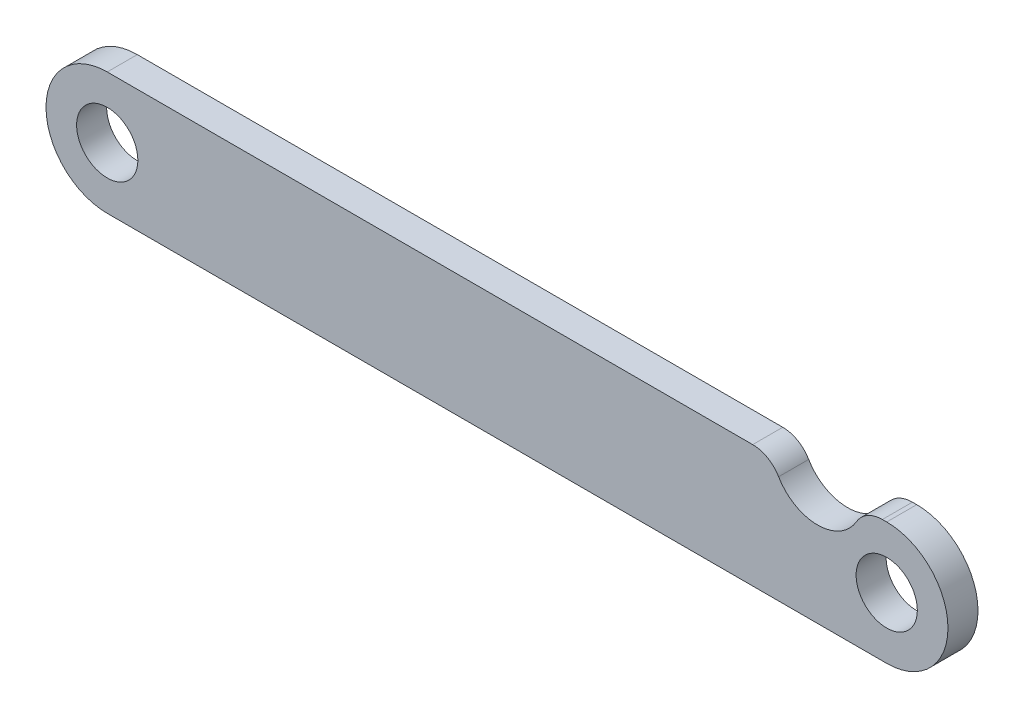
ISO-10303-21;
HEADER;
FILE_DESCRIPTION(('STEP AP214'),'2;1');
FILE_NAME('part.step','',(''),(''),'','','');
FILE_SCHEMA(('AUTOMOTIVE_DESIGN { 1 0 10303 214 1 1 1 1 }'));
ENDSEC;
DATA;
#1=APPLICATION_CONTEXT('core data for automotive mechanical design processes');
#2=APPLICATION_PROTOCOL_DEFINITION('international standard','automotive_design',2000,#1);
#3=PRODUCT_CONTEXT('',#1,'mechanical');
#4=PRODUCT('Part','Part','',(#3));
#5=PRODUCT_RELATED_PRODUCT_CATEGORY('part','',(#4));
#6=PRODUCT_DEFINITION_FORMATION('','',#4);
#7=PRODUCT_DEFINITION_CONTEXT('part definition',#1,'design');
#8=PRODUCT_DEFINITION('design','',#6,#7);
#9=PRODUCT_DEFINITION_SHAPE('','',#8);
#10=(LENGTH_UNIT() NAMED_UNIT(*) SI_UNIT(.MILLI.,.METRE.));
#11=(NAMED_UNIT(*) PLANE_ANGLE_UNIT() SI_UNIT($,.RADIAN.));
#12=(NAMED_UNIT(*) SI_UNIT($,.STERADIAN.) SOLID_ANGLE_UNIT());
#13=UNCERTAINTY_MEASURE_WITH_UNIT(LENGTH_MEASURE(1.E-05),#10,'distance_accuracy_value','');
#14=(GEOMETRIC_REPRESENTATION_CONTEXT(3) GLOBAL_UNCERTAINTY_ASSIGNED_CONTEXT((#13)) GLOBAL_UNIT_ASSIGNED_CONTEXT((#10,
#11,#12)) REPRESENTATION_CONTEXT('',''));
#15=CARTESIAN_POINT('',(0.,0.,0.));
#16=DIRECTION('',(0.,0.,1.));
#17=DIRECTION('',(1.,0.,0.));
#18=AXIS2_PLACEMENT_3D('',#15,#16,#17);
#19=CARTESIAN_POINT('',(0.,2.03803107941855,1.));
#20=DIRECTION('',(0.,1.,0.));
#21=DIRECTION('',(-1.,0.,0.));
#22=AXIS2_PLACEMENT_3D('',#19,#20,#21);
#23=PLANE('',#22);
#24=DIRECTION('',(1.,0.,0.));
#25=VECTOR('',#24,1.);
#26=CARTESIAN_POINT('',(0.,2.03803107941855,0.));
#27=LINE('',#26,#25);
#28=CARTESIAN_POINT('',(-0.144053808082927,2.03803107941855,0.));
#29=VERTEX_POINT('',#28);
#30=CARTESIAN_POINT('',(0.,2.03803107941855,0.));
#31=VERTEX_POINT('',#30);
#32=EDGE_CURVE('E147',#29,#31,#27,.T.);
#33=ORIENTED_EDGE('',*,*,#32,.F.);
#34=DIRECTION('',(0.,0.,-1.));
#35=VECTOR('',#34,1.);
#36=CARTESIAN_POINT('',(-0.144053808082927,2.03803107941855,1.));
#37=LINE('',#36,#35);
#38=CARTESIAN_POINT('',(-0.144053808082927,2.03803107941855,1.));
#39=VERTEX_POINT('',#38);
#40=EDGE_CURVE('E11',#29,#39,#37,.F.);
#41=ORIENTED_EDGE('',*,*,#40,.T.);
#42=DIRECTION('',(1.,0.,0.));
#43=VECTOR('',#42,1.);
#44=CARTESIAN_POINT('',(0.,2.03803107941855,1.));
#45=LINE('',#44,#43);
#46=CARTESIAN_POINT('',(0.,2.03803107941855,1.));
#47=VERTEX_POINT('',#46);
#48=EDGE_CURVE('E127',#39,#47,#45,.T.);
#49=ORIENTED_EDGE('',*,*,#48,.T.);
#50=DIRECTION('',(0.,0.,-1.));
#51=VECTOR('',#50,1.);
#52=CARTESIAN_POINT('',(0.,2.03803107941855,1.));
#53=LINE('',#52,#51);
#54=EDGE_CURVE('E144',#47,#31,#53,.T.);
#55=ORIENTED_EDGE('',*,*,#54,.T.);
#56=EDGE_LOOP('',(#33,#41,#49,#55));
#57=FACE_BOUND('',#56,.T.);
#58=ADVANCED_FACE('F38',(#57),#23,.T.);
#59=CARTESIAN_POINT('',(-25.941113,2.03803107941855,1.));
#60=VERTEX_POINT('',#59);
#61=CARTESIAN_POINT('',(-4.46027180233969,2.03803107941855,1.));
#62=VERTEX_POINT('',#61);
#63=EDGE_CURVE('E108',#60,#62,#45,.T.);
#64=ORIENTED_EDGE('',*,*,#63,.T.);
#65=DIRECTION('',(0.,0.,-1.));
#66=VECTOR('',#65,1.);
#67=CARTESIAN_POINT('',(-4.46027180233969,2.03803107941855,1.));
#68=LINE('',#67,#66);
#69=CARTESIAN_POINT('',(-4.46027180233969,2.03803107941855,0.));
#70=VERTEX_POINT('',#69);
#71=EDGE_CURVE('E114',#62,#70,#68,.T.);
#72=ORIENTED_EDGE('',*,*,#71,.T.);
#73=CARTESIAN_POINT('',(-25.941113,2.03803107941855,0.));
#74=VERTEX_POINT('',#73);
#75=EDGE_CURVE('E111',#74,#70,#27,.T.);
#76=ORIENTED_EDGE('',*,*,#75,.F.);
#77=DIRECTION('',(0.,0.,-1.));
#78=VECTOR('',#77,1.);
#79=CARTESIAN_POINT('',(-25.941113,2.03803107941855,1.));
#80=LINE('',#79,#78);
#81=EDGE_CURVE('E103',#60,#74,#80,.T.);
#82=ORIENTED_EDGE('',*,*,#81,.F.);
#83=EDGE_LOOP('',(#64,#72,#76,#82));
#84=FACE_BOUND('',#83,.T.);
#85=ADVANCED_FACE('F105',(#84),#23,.T.);
#86=CARTESIAN_POINT('',(-25.941113,0.,1.));
#87=DIRECTION('',(0.,0.,-1.));
#88=DIRECTION('',(-1.,0.,0.));
#89=AXIS2_PLACEMENT_3D('',#86,#87,#88);
#90=CYLINDRICAL_SURFACE('',#89,2.03803107941855);
#91=CARTESIAN_POINT('',(-25.941113,0.,0.));
#92=DIRECTION('',(0.,0.,1.));
#93=DIRECTION('',(1.,0.,0.));
#94=AXIS2_PLACEMENT_3D('',#91,#92,#93);
#95=CIRCLE('',#94,2.03803107941855);
#96=CARTESIAN_POINT('',(-25.941113,-2.03803107941855,0.));
#97=VERTEX_POINT('',#96);
#98=EDGE_CURVE('E146',#74,#97,#95,.T.);
#99=ORIENTED_EDGE('',*,*,#98,.T.);
#100=DIRECTION('',(0.,0.,-1.));
#101=VECTOR('',#100,1.);
#102=CARTESIAN_POINT('',(-25.941113,-2.03803107941855,1.));
#103=LINE('',#102,#101);
#104=CARTESIAN_POINT('',(-25.941113,-2.03803107941855,1.));
#105=VERTEX_POINT('',#104);
#106=EDGE_CURVE('E115',#105,#97,#103,.T.);
#107=ORIENTED_EDGE('',*,*,#106,.F.);
#108=CARTESIAN_POINT('',(-25.941113,0.,1.));
#109=DIRECTION('',(0.,0.,1.));
#110=DIRECTION('',(1.,0.,0.));
#111=AXIS2_PLACEMENT_3D('',#108,#109,#110);
#112=CIRCLE('',#111,2.03803107941855);
#113=EDGE_CURVE('E118',#60,#105,#112,.T.);
#114=ORIENTED_EDGE('',*,*,#113,.F.);
#115=ORIENTED_EDGE('',*,*,#81,.T.);
#116=EDGE_LOOP('',(#99,#107,#114,#115));
#117=FACE_BOUND('',#116,.T.);
#118=ADVANCED_FACE('F119',(#117),#90,.T.);
#119=CARTESIAN_POINT('',(0.,-2.03803107941855,1.));
#120=DIRECTION('',(0.,1.,0.));
#121=DIRECTION('',(-1.,0.,0.));
#122=AXIS2_PLACEMENT_3D('',#119,#120,#121);
#123=PLANE('',#122);
#124=DIRECTION('',(1.,0.,0.));
#125=VECTOR('',#124,1.);
#126=CARTESIAN_POINT('',(0.,-2.03803107941855,0.));
#127=LINE('',#126,#125);
#128=CARTESIAN_POINT('',(0.,-2.03803107941855,0.));
#129=VERTEX_POINT('',#128);
#130=EDGE_CURVE('E149',#97,#129,#127,.T.);
#131=ORIENTED_EDGE('',*,*,#130,.T.);
#132=DIRECTION('',(0.,0.,-1.));
#133=VECTOR('',#132,1.);
#134=CARTESIAN_POINT('',(0.,-2.03803107941855,1.));
#135=LINE('',#134,#133);
#136=CARTESIAN_POINT('',(0.,-2.03803107941855,1.));
#137=VERTEX_POINT('',#136);
#138=EDGE_CURVE('E161',#137,#129,#135,.T.);
#139=ORIENTED_EDGE('',*,*,#138,.F.);
#140=DIRECTION('',(1.,0.,0.));
#141=VECTOR('',#140,1.);
#142=CARTESIAN_POINT('',(0.,-2.03803107941855,1.));
#143=LINE('',#142,#141);
#144=EDGE_CURVE('E122',#105,#137,#143,.T.);
#145=ORIENTED_EDGE('',*,*,#144,.F.);
#146=ORIENTED_EDGE('',*,*,#106,.T.);
#147=EDGE_LOOP('',(#131,#139,#145,#146));
#148=FACE_BOUND('',#147,.T.);
#149=ADVANCED_FACE('F188',(#148),#123,.F.);
#150=CARTESIAN_POINT('',(0.,0.,1.));
#151=DIRECTION('',(0.,0.,-1.));
#152=DIRECTION('',(-1.,0.,0.));
#153=AXIS2_PLACEMENT_3D('',#150,#151,#152);
#154=CYLINDRICAL_SURFACE('',#153,1.01901553970927);
#155=CARTESIAN_POINT('',(0.,0.,1.));
#156=DIRECTION('',(0.,0.,1.));
#157=DIRECTION('',(1.,0.,0.));
#158=AXIS2_PLACEMENT_3D('',#155,#156,#157);
#159=CIRCLE('',#158,1.01901553970927);
#160=CARTESIAN_POINT('',(1.01901553970927,0.,1.));
#161=VERTEX_POINT('',#160);
#162=EDGE_CURVE('E138',#161,#161,#159,.T.);
#163=ORIENTED_EDGE('',*,*,#162,.T.);
#164=EDGE_LOOP('',(#163));
#165=FACE_BOUND('',#164,.T.);
#166=CARTESIAN_POINT('',(0.,0.,0.));
#167=DIRECTION('',(0.,0.,1.));
#168=DIRECTION('',(1.,0.,0.));
#169=AXIS2_PLACEMENT_3D('',#166,#167,#168);
#170=CIRCLE('',#169,1.01901553970927);
#171=CARTESIAN_POINT('',(1.01901553970927,0.,0.));
#172=VERTEX_POINT('',#171);
#173=EDGE_CURVE('E154',#172,#172,#170,.T.);
#174=ORIENTED_EDGE('',*,*,#173,.F.);
#175=EDGE_LOOP('',(#174));
#176=FACE_BOUND('',#175,.T.);
#177=ADVANCED_FACE('F212',(#165,#176),#154,.F.);
#178=CARTESIAN_POINT('',(0.,0.,1.));
#179=DIRECTION('',(0.,0.,-1.));
#180=DIRECTION('',(-1.,0.,0.));
#181=AXIS2_PLACEMENT_3D('',#178,#179,#180);
#182=CYLINDRICAL_SURFACE('',#181,2.03803107941855);
#183=CARTESIAN_POINT('',(0.,0.,0.));
#184=DIRECTION('',(0.,0.,1.));
#185=DIRECTION('',(1.,0.,0.));
#186=AXIS2_PLACEMENT_3D('',#183,#184,#185);
#187=CIRCLE('',#186,2.03803107941855);
#188=EDGE_CURVE('E151',#129,#31,#187,.T.);
#189=ORIENTED_EDGE('',*,*,#188,.T.);
#190=ORIENTED_EDGE('',*,*,#54,.F.);
#191=CARTESIAN_POINT('',(0.,0.,1.));
#192=DIRECTION('',(0.,0.,1.));
#193=DIRECTION('',(1.,0.,0.));
#194=AXIS2_PLACEMENT_3D('',#191,#192,#193);
#195=CIRCLE('',#194,2.03803107941855);
#196=EDGE_CURVE('E135',#137,#47,#195,.T.);
#197=ORIENTED_EDGE('',*,*,#196,.F.);
#198=ORIENTED_EDGE('',*,*,#138,.T.);
#199=EDGE_LOOP('',(#189,#190,#197,#198));
#200=FACE_BOUND('',#199,.T.);
#201=ADVANCED_FACE('F193',(#200),#182,.T.);
#202=CARTESIAN_POINT('',(-25.941113,0.,1.));
#203=DIRECTION('',(0.,0.,-1.));
#204=DIRECTION('',(-1.,0.,0.));
#205=AXIS2_PLACEMENT_3D('',#202,#203,#204);
#206=CYLINDRICAL_SURFACE('',#205,1.01901553970927);
#207=CARTESIAN_POINT('',(-25.941113,0.,1.));
#208=DIRECTION('',(0.,0.,1.));
#209=DIRECTION('',(1.,0.,0.));
#210=AXIS2_PLACEMENT_3D('',#207,#208,#209);
#211=CIRCLE('',#210,1.01901553970927);
#212=CARTESIAN_POINT('',(-24.9220974602907,0.,1.));
#213=VERTEX_POINT('',#212);
#214=EDGE_CURVE('E141',#213,#213,#211,.T.);
#215=ORIENTED_EDGE('',*,*,#214,.T.);
#216=EDGE_LOOP('',(#215));
#217=FACE_BOUND('',#216,.T.);
#218=CARTESIAN_POINT('',(-25.941113,0.,0.));
#219=DIRECTION('',(0.,0.,1.));
#220=DIRECTION('',(1.,0.,0.));
#221=AXIS2_PLACEMENT_3D('',#218,#219,#220);
#222=CIRCLE('',#221,1.01901553970927);
#223=CARTESIAN_POINT('',(-24.9220974602907,0.,0.));
#224=VERTEX_POINT('',#223);
#225=EDGE_CURVE('E129',#224,#224,#222,.T.);
#226=ORIENTED_EDGE('',*,*,#225,.F.);
#227=EDGE_LOOP('',(#226));
#228=FACE_BOUND('',#227,.T.);
#229=ADVANCED_FACE('F215',(#217,#228),#206,.F.);
#230=CARTESIAN_POINT('',(0.,0.,1.));
#231=DIRECTION('',(0.,0.,1.));
#232=DIRECTION('',(1.,0.,0.));
#233=AXIS2_PLACEMENT_3D('',#230,#231,#232);
#234=PLANE('',#233);
#235=CARTESIAN_POINT('',(-2.30216280521131,2.3,1.));
#236=DIRECTION('',(0.,0.,1.));
#237=DIRECTION('',(1.,0.,0.));
#238=AXIS2_PLACEMENT_3D('',#235,#236,#237);
#239=CIRCLE('',#238,1.5);
#240=CARTESIAN_POINT('',(-3.59702820348834,1.54281864765113,1.));
#241=VERTEX_POINT('',#240);
#242=CARTESIAN_POINT('',(-1.00729740693428,1.54281864765113,1.));
#243=VERTEX_POINT('',#242);
#244=EDGE_CURVE('E178',#241,#243,#239,.T.);
#245=ORIENTED_EDGE('',*,*,#244,.F.);
#246=CARTESIAN_POINT('',(-4.46027180233969,1.03803107941855,1.));
#247=DIRECTION('',(0.,0.,1.));
#248=DIRECTION('',(1.,0.,0.));
#249=AXIS2_PLACEMENT_3D('',#246,#247,#248);
#250=CIRCLE('',#249,1.);
#251=EDGE_CURVE('E46',#241,#62,#250,.T.);
#252=ORIENTED_EDGE('',*,*,#251,.T.);
#253=ORIENTED_EDGE('',*,*,#63,.F.);
#254=ORIENTED_EDGE('',*,*,#113,.T.);
#255=ORIENTED_EDGE('',*,*,#144,.T.);
#256=ORIENTED_EDGE('',*,*,#196,.T.);
#257=ORIENTED_EDGE('',*,*,#48,.F.);
#258=CARTESIAN_POINT('',(-0.144053808082927,1.03803107941855,1.));
#259=DIRECTION('',(0.,0.,1.));
#260=DIRECTION('',(1.,0.,0.));
#261=AXIS2_PLACEMENT_3D('',#258,#259,#260);
#262=CIRCLE('',#261,1.);
#263=EDGE_CURVE('E53',#39,#243,#262,.T.);
#264=ORIENTED_EDGE('',*,*,#263,.T.);
#265=EDGE_LOOP('',(#245,#252,#253,#254,#255,#256,#257,#264));
#266=FACE_BOUND('',#265,.T.);
#267=ORIENTED_EDGE('',*,*,#162,.F.);
#268=EDGE_LOOP('',(#267));
#269=FACE_BOUND('',#268,.T.);
#270=ORIENTED_EDGE('',*,*,#214,.F.);
#271=EDGE_LOOP('',(#270));
#272=FACE_BOUND('',#271,.T.);
#273=ADVANCED_FACE('F124',(#266,#269,#272),#234,.T.);
#274=CARTESIAN_POINT('',(0.,0.,0.));
#275=DIRECTION('',(0.,0.,1.));
#276=DIRECTION('',(1.,0.,0.));
#277=AXIS2_PLACEMENT_3D('',#274,#275,#276);
#278=PLANE('',#277);
#279=ORIENTED_EDGE('',*,*,#75,.T.);
#280=CARTESIAN_POINT('',(-4.46027180233969,1.03803107941855,0.));
#281=DIRECTION('',(0.,0.,1.));
#282=DIRECTION('',(1.,0.,0.));
#283=AXIS2_PLACEMENT_3D('',#280,#281,#282);
#284=CIRCLE('',#283,1.);
#285=CARTESIAN_POINT('',(-3.59702820348834,1.54281864765113,0.));
#286=VERTEX_POINT('',#285);
#287=EDGE_CURVE('E168',#70,#286,#284,.F.);
#288=ORIENTED_EDGE('',*,*,#287,.T.);
#289=CARTESIAN_POINT('',(-2.30216280521131,2.3,0.));
#290=DIRECTION('',(0.,0.,1.));
#291=DIRECTION('',(1.,0.,0.));
#292=AXIS2_PLACEMENT_3D('',#289,#290,#291);
#293=CIRCLE('',#292,1.5);
#294=CARTESIAN_POINT('',(-1.00729740693428,1.54281864765113,0.));
#295=VERTEX_POINT('',#294);
#296=EDGE_CURVE('E131',#286,#295,#293,.T.);
#297=ORIENTED_EDGE('',*,*,#296,.T.);
#298=CARTESIAN_POINT('',(-0.144053808082927,1.03803107941855,0.));
#299=DIRECTION('',(0.,0.,1.));
#300=DIRECTION('',(1.,0.,0.));
#301=AXIS2_PLACEMENT_3D('',#298,#299,#300);
#302=CIRCLE('',#301,1.);
#303=EDGE_CURVE('E166',#295,#29,#302,.F.);
#304=ORIENTED_EDGE('',*,*,#303,.T.);
#305=ORIENTED_EDGE('',*,*,#32,.T.);
#306=ORIENTED_EDGE('',*,*,#188,.F.);
#307=ORIENTED_EDGE('',*,*,#130,.F.);
#308=ORIENTED_EDGE('',*,*,#98,.F.);
#309=EDGE_LOOP('',(#279,#288,#297,#304,#305,#306,#307,#308));
#310=FACE_BOUND('',#309,.T.);
#311=ORIENTED_EDGE('',*,*,#173,.T.);
#312=EDGE_LOOP('',(#311));
#313=FACE_BOUND('',#312,.T.);
#314=ORIENTED_EDGE('',*,*,#225,.T.);
#315=EDGE_LOOP('',(#314));
#316=FACE_BOUND('',#315,.T.);
#317=ADVANCED_FACE('F183',(#310,#313,#316),#278,.F.);
#318=CARTESIAN_POINT('',(-2.30216280521131,2.3,1.));
#319=DIRECTION('',(0.,0.,-1.));
#320=DIRECTION('',(-1.,0.,0.));
#321=AXIS2_PLACEMENT_3D('',#318,#319,#320);
#322=CYLINDRICAL_SURFACE('',#321,1.5);
#323=ORIENTED_EDGE('',*,*,#296,.F.);
#324=DIRECTION('',(0.,0.,-1.));
#325=VECTOR('',#324,1.);
#326=CARTESIAN_POINT('',(-3.59702820348834,1.54281864765113,1.));
#327=LINE('',#326,#325);
#328=EDGE_CURVE('E172',#286,#241,#327,.F.);
#329=ORIENTED_EDGE('',*,*,#328,.T.);
#330=ORIENTED_EDGE('',*,*,#244,.T.);
#331=DIRECTION('',(0.,0.,-1.));
#332=VECTOR('',#331,1.);
#333=CARTESIAN_POINT('',(-1.00729740693428,1.54281864765113,1.));
#334=LINE('',#333,#332);
#335=EDGE_CURVE('E170',#243,#295,#334,.T.);
#336=ORIENTED_EDGE('',*,*,#335,.T.);
#337=EDGE_LOOP('',(#323,#329,#330,#336));
#338=FACE_BOUND('',#337,.T.);
#339=ADVANCED_FACE('F177',(#338),#322,.F.);
#340=CARTESIAN_POINT('',(-4.46027180233969,1.03803107941855,1.));
#341=DIRECTION('',(0.,0.,-1.));
#342=DIRECTION('',(-1.,0.,0.));
#343=AXIS2_PLACEMENT_3D('',#340,#341,#342);
#344=CYLINDRICAL_SURFACE('',#343,1.);
#345=ORIENTED_EDGE('',*,*,#251,.F.);
#346=ORIENTED_EDGE('',*,*,#328,.F.);
#347=ORIENTED_EDGE('',*,*,#287,.F.);
#348=ORIENTED_EDGE('',*,*,#71,.F.);
#349=EDGE_LOOP('',(#345,#346,#347,#348));
#350=FACE_BOUND('',#349,.T.);
#351=ADVANCED_FACE('F181',(#350),#344,.T.);
#352=CARTESIAN_POINT('',(-0.144053808082927,1.03803107941855,1.));
#353=DIRECTION('',(0.,0.,-1.));
#354=DIRECTION('',(-1.,0.,0.));
#355=AXIS2_PLACEMENT_3D('',#352,#353,#354);
#356=CYLINDRICAL_SURFACE('',#355,1.);
#357=ORIENTED_EDGE('',*,*,#303,.F.);
#358=ORIENTED_EDGE('',*,*,#335,.F.);
#359=ORIENTED_EDGE('',*,*,#263,.F.);
#360=ORIENTED_EDGE('',*,*,#40,.F.);
#361=EDGE_LOOP('',(#357,#358,#359,#360));
#362=FACE_BOUND('',#361,.T.);
#363=ADVANCED_FACE('F40',(#362),#356,.T.);
#364=CLOSED_SHELL('',(#58,#85,#118,#149,#177,#201,#229,#273,#317,#339,#351,#363));
#365=MANIFOLD_SOLID_BREP('B2',#364);
#366=ADVANCED_BREP_SHAPE_REPRESENTATION('',(#18,#365),#14);
#367=SHAPE_DEFINITION_REPRESENTATION(#9,#366);
ENDSEC;
END-ISO-10303-21;
